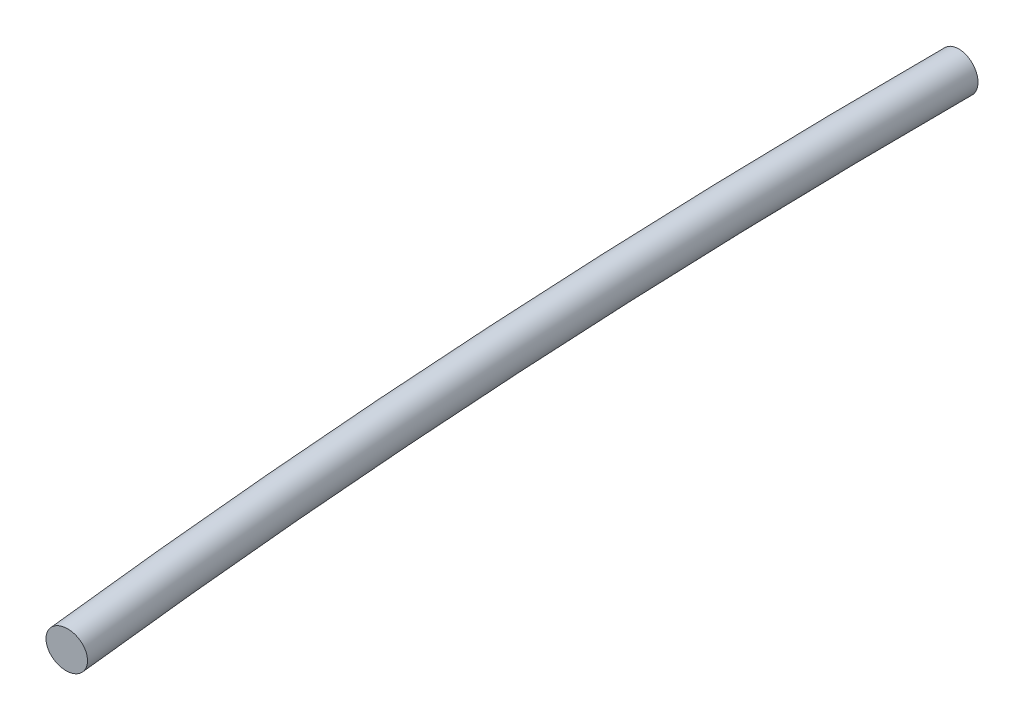
ISO-10303-21;
HEADER;
FILE_DESCRIPTION(('STEP AP214'),'2;1');
FILE_NAME('part.step','',(''),(''),'','','');
FILE_SCHEMA(('AUTOMOTIVE_DESIGN { 1 0 10303 214 1 1 1 1 }'));
ENDSEC;
DATA;
#1=APPLICATION_CONTEXT('core data for automotive mechanical design processes');
#2=APPLICATION_PROTOCOL_DEFINITION('international standard','automotive_design',2000,#1);
#3=PRODUCT_CONTEXT('',#1,'mechanical');
#4=PRODUCT('Part','Part','',(#3));
#5=PRODUCT_RELATED_PRODUCT_CATEGORY('part','',(#4));
#6=PRODUCT_DEFINITION_FORMATION('','',#4);
#7=PRODUCT_DEFINITION_CONTEXT('part definition',#1,'design');
#8=PRODUCT_DEFINITION('design','',#6,#7);
#9=PRODUCT_DEFINITION_SHAPE('','',#8);
#10=(LENGTH_UNIT() NAMED_UNIT(*) SI_UNIT(.MILLI.,.METRE.));
#11=(NAMED_UNIT(*) PLANE_ANGLE_UNIT() SI_UNIT($,.RADIAN.));
#12=(NAMED_UNIT(*) SI_UNIT($,.STERADIAN.) SOLID_ANGLE_UNIT());
#13=UNCERTAINTY_MEASURE_WITH_UNIT(LENGTH_MEASURE(1.E-05),#10,'distance_accuracy_value','');
#14=(GEOMETRIC_REPRESENTATION_CONTEXT(3) GLOBAL_UNCERTAINTY_ASSIGNED_CONTEXT((#13)) GLOBAL_UNIT_ASSIGNED_CONTEXT((#10,
#11,#12)) REPRESENTATION_CONTEXT('',''));
#15=CARTESIAN_POINT('',(0.,0.,0.));
#16=DIRECTION('',(0.,0.,1.));
#17=DIRECTION('',(1.,0.,0.));
#18=AXIS2_PLACEMENT_3D('',#15,#16,#17);
#19=CARTESIAN_POINT('',(25278.4886996587,-25142.9216229116,2.24770602130775E-06));
#20=DIRECTION('',(-0.48820362407971,-0.872729752807498,0.));
#21=DIRECTION('',(0.872729752807499,-0.48820362407971,0.));
#22=AXIS2_PLACEMENT_3D('',#19,#20,#21);
#23=TOROIDAL_SURFACE('',#22,27962.1982441095,50.7999999999937);
#24=CARTESIAN_POINT('',(967.774818601376,-11543.5472661685,2435.31073014403));
#25=DIRECTION('',(0.076008621102181,-0.0425191007456936,0.996200188511287));
#26=DIRECTION('',(0.997105846139529,0.00161898502804675,-0.0760086211021808));
#27=AXIS2_PLACEMENT_3D('',#24,#25,#26);
#28=CIRCLE('',#27,50.7999999999937);
#29=CARTESIAN_POINT('',(923.608610552357,-11518.8407602174,2439.73505272042));
#30=VERTEX_POINT('',#29);
#31=EDGE_CURVE('E10',#30,#30,#28,.T.);
#32=CARTESIAN_POINT('',(875.046338122692,-11491.6751029021,0.));
#33=DIRECTION('',(0.,0.,1.));
#34=DIRECTION('',(1.,0.,0.));
#35=AXIS2_PLACEMENT_3D('',#32,#33,#34);
#36=CIRCLE('',#35,50.7999999999937);
#37=CARTESIAN_POINT('',(830.711666680088,-11466.8743587988,-4.08349389721005E-09));
#38=VERTEX_POINT('',#37);
#39=EDGE_CURVE('E39',#38,#38,#36,.T.);
#40=CARTESIAN_POINT('',(25278.4886996587,-25142.9216229116,2.24770602130775E-06));
#41=DIRECTION('',(-0.48820362407971,-0.872729752807498,0.));
#42=DIRECTION('',(0.872729752807499,-0.48820362407971,0.));
#43=AXIS2_PLACEMENT_3D('',#40,#41,#42);
#44=CIRCLE('',#43,28012.9982441095);
#45=EDGE_CURVE('',#30,#38,#44,.T.);
#46=ORIENTED_EDGE('',*,*,#31,.F.);
#47=ORIENTED_EDGE('',*,*,#39,.T.);
#48=ORIENTED_EDGE('',*,*,#45,.T.);
#49=ORIENTED_EDGE('',*,*,#45,.F.);
#50=EDGE_LOOP('',(#46,#48,#47,#49));
#51=FACE_BOUND('',#50,.T.);
#52=ADVANCED_FACE('F33',(#51),#23,.T.);
#53=CARTESIAN_POINT('',(967.774818601376,-11543.5472661685,2435.31073014403));
#54=DIRECTION('',(0.076008621102181,-0.0425191007456936,0.996200188511287));
#55=DIRECTION('',(0.997105846139529,0.00161898502804675,-0.0760086211021808));
#56=AXIS2_PLACEMENT_3D('',#53,#54,#55);
#57=PLANE('',#56);
#58=ORIENTED_EDGE('',*,*,#31,.T.);
#59=EDGE_LOOP('',(#58));
#60=FACE_BOUND('',#59,.T.);
#61=ADVANCED_FACE('F48',(#60),#57,.T.);
#62=CARTESIAN_POINT('',(875.046338122692,-11491.6751029021,0.));
#63=DIRECTION('',(0.,0.,1.));
#64=DIRECTION('',(1.,0.,0.));
#65=AXIS2_PLACEMENT_3D('',#62,#63,#64);
#66=PLANE('',#65);
#67=ORIENTED_EDGE('',*,*,#39,.F.);
#68=EDGE_LOOP('',(#67));
#69=FACE_BOUND('',#68,.T.);
#70=ADVANCED_FACE('F46',(#69),#66,.F.);
#71=CLOSED_SHELL('',(#52,#61,#70));
#72=MANIFOLD_SOLID_BREP('B2',#71);
#73=ADVANCED_BREP_SHAPE_REPRESENTATION('',(#18,#72),#14);
#74=SHAPE_DEFINITION_REPRESENTATION(#9,#73);
ENDSEC;
END-ISO-10303-21;
